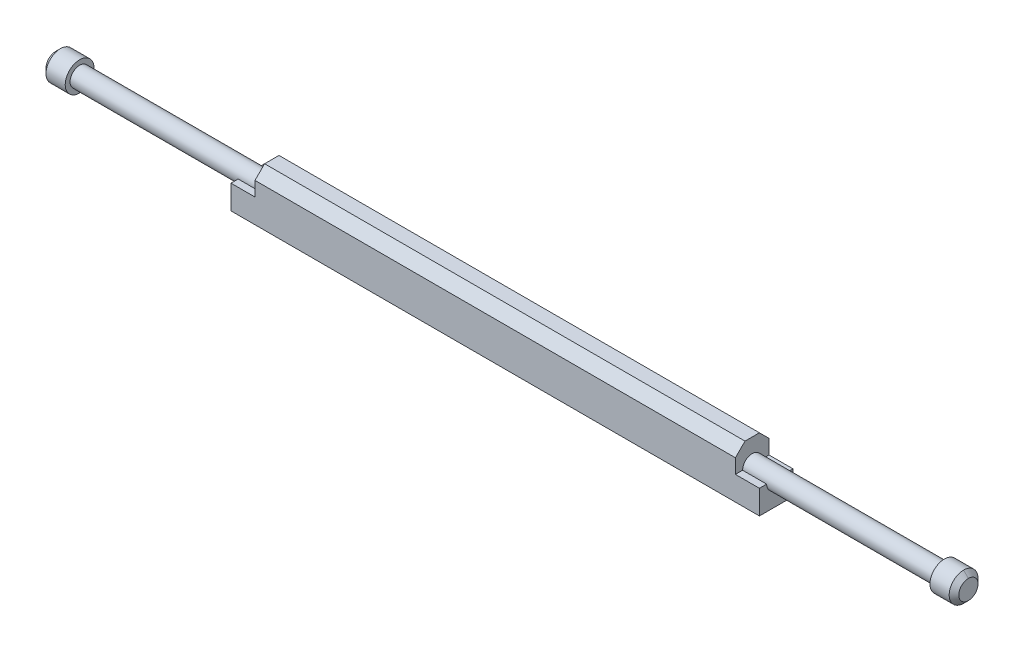
ISO-10303-21;
HEADER;
FILE_DESCRIPTION(('STEP AP214'),'2;1');
FILE_NAME('part.step','',(''),(''),'','','');
FILE_SCHEMA(('AUTOMOTIVE_DESIGN { 1 0 10303 214 1 1 1 1 }'));
ENDSEC;
DATA;
#1=APPLICATION_CONTEXT('core data for automotive mechanical design processes');
#2=APPLICATION_PROTOCOL_DEFINITION('international standard','automotive_design',2000,#1);
#3=PRODUCT_CONTEXT('',#1,'mechanical');
#4=PRODUCT('Part','Part','',(#3));
#5=PRODUCT_RELATED_PRODUCT_CATEGORY('part','',(#4));
#6=PRODUCT_DEFINITION_FORMATION('','',#4);
#7=PRODUCT_DEFINITION_CONTEXT('part definition',#1,'design');
#8=PRODUCT_DEFINITION('design','',#6,#7);
#9=PRODUCT_DEFINITION_SHAPE('','',#8);
#10=(LENGTH_UNIT() NAMED_UNIT(*) SI_UNIT(.MILLI.,.METRE.));
#11=(NAMED_UNIT(*) PLANE_ANGLE_UNIT() SI_UNIT($,.RADIAN.));
#12=(NAMED_UNIT(*) SI_UNIT($,.STERADIAN.) SOLID_ANGLE_UNIT());
#13=UNCERTAINTY_MEASURE_WITH_UNIT(LENGTH_MEASURE(1.E-05),#10,'distance_accuracy_value','');
#14=(GEOMETRIC_REPRESENTATION_CONTEXT(3) GLOBAL_UNCERTAINTY_ASSIGNED_CONTEXT((#13)) GLOBAL_UNIT_ASSIGNED_CONTEXT((#10,
#11,#12)) REPRESENTATION_CONTEXT('',''));
#15=CARTESIAN_POINT('',(0.,0.,0.));
#16=DIRECTION('',(0.,0.,1.));
#17=DIRECTION('',(1.,0.,0.));
#18=AXIS2_PLACEMENT_3D('',#15,#16,#17);
#19=CARTESIAN_POINT('',(95.0000003599995,6.8791694523184E-06,0.));
#20=DIRECTION('',(0.999999999999998,7.24123097499998E-08,0.));
#21=DIRECTION('',(-7.24123097499998E-08,0.999999999999997,0.));
#22=AXIS2_PLACEMENT_3D('',#19,#20,#21);
#23=PLANE('',#22);
#24=CARTESIAN_POINT('',(95.0000003625671,3.32969058710601E-06,3.5));
#25=DIRECTION('',(-0.999999999999998,-7.24123157157635E-08,0.));
#26=DIRECTION('',(7.24123157157635E-08,-0.999999999999997,0.));
#27=AXIS2_PLACEMENT_3D('',#24,#25,#26);
#28=CIRCLE('',#27,2.00000000256702);
#29=CARTESIAN_POINT('',(95.0000002177424,2.00000333212355,3.5));
#30=VERTEX_POINT('',#29);
#31=CARTESIAN_POINT('',(95.0000005073246,-1.99999667267535,3.5));
#32=VERTEX_POINT('',#31);
#33=EDGE_CURVE('E20',#30,#32,#28,.F.);
#34=ORIENTED_EDGE('',*,*,#33,.T.);
#35=CARTESIAN_POINT('',(95.000000362433,3.32969058728775E-06,3.5));
#36=DIRECTION('',(-0.999999999999998,-7.24123053298279E-08,0.));
#37=DIRECTION('',(7.24123053298279E-08,-0.999999999999997,0.));
#38=AXIS2_PLACEMENT_3D('',#35,#36,#37);
#39=CIRCLE('',#38,2.00000000243298);
#40=EDGE_CURVE('E144',#32,#30,#39,.F.);
#41=ORIENTED_EDGE('',*,*,#40,.T.);
#42=EDGE_LOOP('',(#34,#41));
#43=FACE_BOUND('',#42,.T.);
#44=ADVANCED_FACE('F17',(#43),#23,.T.);
#45=CARTESIAN_POINT('',(-95.0000003599995,6.8791694523184E-06,0.));
#46=DIRECTION('',(0.999999999999998,-7.24123097499998E-08,0.));
#47=DIRECTION('',(7.24123097499998E-08,0.999999999999997,0.));
#48=AXIS2_PLACEMENT_3D('',#45,#46,#47);
#49=PLANE('',#48);
#50=CARTESIAN_POINT('',(-95.000000362433,3.32969058923931E-06,3.5));
#51=DIRECTION('',(0.999999999999998,-7.24123053298278E-08,0.));
#52=DIRECTION('',(7.24123053298278E-08,0.999999999999997,0.));
#53=AXIS2_PLACEMENT_3D('',#50,#51,#52);
#54=CIRCLE('',#53,2.000000002433);
#55=CARTESIAN_POINT('',(-95.0000002176084,2.00000333225761,3.5));
#56=VERTEX_POINT('',#55);
#57=CARTESIAN_POINT('',(-95.0000005072576,-1.99999667287644,3.5));
#58=VERTEX_POINT('',#57);
#59=EDGE_CURVE('E154',#56,#58,#54,.F.);
#60=ORIENTED_EDGE('',*,*,#59,.T.);
#61=CARTESIAN_POINT('',(-95.000000362567,3.32969058905758E-06,3.5));
#62=DIRECTION('',(0.999999999999998,-7.24123157157635E-08,0.));
#63=DIRECTION('',(7.24123157157635E-08,0.999999999999997,0.));
#64=AXIS2_PLACEMENT_3D('',#61,#62,#63);
#65=CIRCLE('',#64,2.00000000256706);
#66=EDGE_CURVE('E201',#58,#56,#65,.F.);
#67=ORIENTED_EDGE('',*,*,#66,.T.);
#68=EDGE_LOOP('',(#60,#67));
#69=FACE_BOUND('',#68,.T.);
#70=ADVANCED_FACE('F640',(#69),#49,.F.);
#71=CARTESIAN_POINT('',(95.0000003648246,3.32969058726949E-06,3.5));
#72=DIRECTION('',(-0.999999999999998,-7.24123157157635E-08,0.));
#73=DIRECTION('',(7.24123157157635E-08,-0.999999999999997,0.));
#74=AXIS2_PLACEMENT_3D('',#71,#72,#73);
#75=CONICAL_SURFACE('',#74,2.00000000030942,0.785398159309759);
#76=CARTESIAN_POINT('',(94.00000036,3.2572782765E-06,3.5));
#77=DIRECTION('',(0.999999999999998,7.24123089999999E-08,0.));
#78=DIRECTION('',(-7.24123076383067E-08,0.999999999999997,0.));
#79=AXIS2_PLACEMENT_3D('',#76,#77,#78);
#80=CIRCLE('',#79,2.99999999972173);
#81=CARTESIAN_POINT('',(94.0000001431433,3.00000325772801,3.5));
#82=VERTEX_POINT('',#81);
#83=CARTESIAN_POINT('',(94.0000005776171,-2.99999674317146,3.5));
#84=VERTEX_POINT('',#83);
#85=EDGE_CURVE('E153',#82,#84,#80,.T.);
#86=ORIENTED_EDGE('',*,*,#85,.T.);
#87=DIRECTION('',(-0.707106730628404,-0.707106831744687,0.));
#88=VECTOR('',#87,1.);
#89=CARTESIAN_POINT('',(94.500000545,-2.4999967065,3.5));
#90=LINE('',#89,#88);
#91=EDGE_CURVE('E147',#84,#32,#90,.F.);
#92=ORIENTED_EDGE('',*,*,#91,.T.);
#93=ORIENTED_EDGE('',*,*,#33,.F.);
#94=DIRECTION('',(0.707106833034876,-0.707106729338216,0.));
#95=VECTOR('',#94,1.);
#96=CARTESIAN_POINT('',(94.5000001829384,2.50000329346887,3.5));
#97=LINE('',#96,#95);
#98=EDGE_CURVE('E149',#30,#82,#97,.F.);
#99=ORIENTED_EDGE('',*,*,#98,.T.);
#100=EDGE_LOOP('',(#86,#92,#93,#99));
#101=FACE_BOUND('',#100,.T.);
#102=ADVANCED_FACE('F152',(#101),#75,.T.);
#103=CARTESIAN_POINT('',(95.0000003651754,3.32969058748633E-06,3.5));
#104=DIRECTION('',(-0.999999999999998,-7.24123053298279E-08,0.));
#105=DIRECTION('',(7.24123053298279E-08,-0.999999999999997,0.));
#106=AXIS2_PLACEMENT_3D('',#103,#104,#105);
#107=CONICAL_SURFACE('',#106,1.99999999969059,0.785398162485149);
#108=CARTESIAN_POINT('',(94.00000036,3.2572782765E-06,3.5));
#109=DIRECTION('',(0.999999999999998,7.24123089999999E-08,0.));
#110=DIRECTION('',(7.2412307624873E-08,-0.999999999999997,0.));
#111=AXIS2_PLACEMENT_3D('',#108,#109,#110);
#112=CIRCLE('',#111,3.00000000027828);
#113=EDGE_CURVE('E221',#84,#82,#112,.T.);
#114=ORIENTED_EDGE('',*,*,#113,.T.);
#115=ORIENTED_EDGE('',*,*,#98,.F.);
#116=ORIENTED_EDGE('',*,*,#40,.F.);
#117=ORIENTED_EDGE('',*,*,#91,.F.);
#118=EDGE_LOOP('',(#114,#115,#116,#117));
#119=FACE_BOUND('',#118,.T.);
#120=ADVANCED_FACE('F146',(#119),#107,.T.);
#121=CARTESIAN_POINT('',(-95.0000003651754,3.3296905894379E-06,3.5));
#122=DIRECTION('',(0.999999999999998,-7.24123053298278E-08,0.));
#123=DIRECTION('',(7.24123053298278E-08,0.999999999999997,0.));
#124=AXIS2_PLACEMENT_3D('',#121,#122,#123);
#125=CONICAL_SURFACE('',#124,1.99999999969059,0.785398162485149);
#126=ORIENTED_EDGE('',*,*,#59,.F.);
#127=DIRECTION('',(0.707106835280216,0.707106727092874,0.));
#128=VECTOR('',#127,1.);
#129=CARTESIAN_POINT('',(-94.50000018,2.5000032935,3.5));
#130=LINE('',#129,#128);
#131=CARTESIAN_POINT('',(-94.0000001423829,3.00000325682854,3.5));
#132=VERTEX_POINT('',#131);
#133=EDGE_CURVE('E203',#56,#132,#130,.T.);
#134=ORIENTED_EDGE('',*,*,#133,.T.);
#135=CARTESIAN_POINT('',(-94.00000036,3.257278278E-06,3.5));
#136=DIRECTION('',(0.999999999999998,-7.24123100000001E-08,0.));
#137=DIRECTION('',(-7.24123076248729E-08,-0.999999999999997,0.));
#138=AXIS2_PLACEMENT_3D('',#135,#136,#137);
#139=CIRCLE('',#138,3.00000000027829);
#140=CARTESIAN_POINT('',(-94.0000005768568,-2.99999674227198,3.5));
#141=VERTEX_POINT('',#140);
#142=EDGE_CURVE('E223',#132,#141,#139,.F.);
#143=ORIENTED_EDGE('',*,*,#142,.T.);
#144=DIRECTION('',(-0.707106732873745,0.707106829499347,0.));
#145=VECTOR('',#144,1.);
#146=CARTESIAN_POINT('',(-94.5000005420615,-2.49999670653113,3.5));
#147=LINE('',#146,#145);
#148=EDGE_CURVE('E156',#141,#58,#147,.T.);
#149=ORIENTED_EDGE('',*,*,#148,.T.);
#150=EDGE_LOOP('',(#126,#134,#143,#149));
#151=FACE_BOUND('',#150,.T.);
#152=ADVANCED_FACE('F617',(#151),#125,.T.);
#153=CARTESIAN_POINT('',(-95.0000003648246,3.32969058922106E-06,3.5));
#154=DIRECTION('',(0.999999999999998,-7.24123157157635E-08,0.));
#155=DIRECTION('',(7.24123157157635E-08,0.999999999999997,0.));
#156=AXIS2_PLACEMENT_3D('',#153,#154,#155);
#157=CONICAL_SURFACE('',#156,2.00000000030942,0.785398159309759);
#158=ORIENTED_EDGE('',*,*,#66,.F.);
#159=ORIENTED_EDGE('',*,*,#148,.F.);
#160=CARTESIAN_POINT('',(-94.00000036,3.257278278E-06,3.5));
#161=DIRECTION('',(0.999999999999998,-7.24123100000001E-08,0.));
#162=DIRECTION('',(7.2412312264236E-08,0.999999999999997,0.));
#163=AXIS2_PLACEMENT_3D('',#160,#161,#162);
#164=CIRCLE('',#163,2.99999999972173);
#165=EDGE_CURVE('E200',#141,#132,#164,.F.);
#166=ORIENTED_EDGE('',*,*,#165,.T.);
#167=ORIENTED_EDGE('',*,*,#133,.F.);
#168=EDGE_LOOP('',(#158,#159,#166,#167));
#169=FACE_BOUND('',#168,.T.);
#170=ADVANCED_FACE('F608',(#169),#157,.T.);
#171=CARTESIAN_POINT('',(90.0000003627631,2.96762904094389E-06,3.5));
#172=DIRECTION('',(0.999999999999998,7.24123053275792E-08,0.));
#173=DIRECTION('',(-7.24123053275792E-08,0.999999999999997,0.));
#174=AXIS2_PLACEMENT_3D('',#171,#172,#173);
#175=CYLINDRICAL_SURFACE('',#174,2.99999999995366);
#176=CARTESIAN_POINT('',(90.00000036,2.9676290407438E-06,3.5));
#177=DIRECTION('',(0.999999999999998,7.24123053275792E-08,0.));
#178=DIRECTION('',(-7.24123053275792E-08,0.999999999999997,0.));
#179=AXIS2_PLACEMENT_3D('',#176,#177,#178);
#180=CIRCLE('',#179,2.99999999995366);
#181=CARTESIAN_POINT('',(90.0000001427631,3.00000296758269,3.5));
#182=VERTEX_POINT('',#181);
#183=EDGE_CURVE('E197',#182,#182,#180,.T.);
#184=ORIENTED_EDGE('',*,*,#183,.T.);
#185=EDGE_LOOP('',(#184));
#186=FACE_BOUND('',#185,.T.);
#187=ORIENTED_EDGE('',*,*,#85,.F.);
#188=ORIENTED_EDGE('',*,*,#113,.F.);
#189=EDGE_LOOP('',(#187,#188));
#190=FACE_BOUND('',#189,.T.);
#191=ADVANCED_FACE('F599',(#186,#190),#175,.T.);
#192=CARTESIAN_POINT('',(-94.0000003572369,3.25727827761406E-06,3.5));
#193=DIRECTION('',(0.999999999999998,-7.24123168901653E-08,0.));
#194=DIRECTION('',(7.24123168901653E-08,0.999999999999997,0.));
#195=AXIS2_PLACEMENT_3D('',#192,#193,#194);
#196=CYLINDRICAL_SURFACE('',#195,3.00000000004636);
#197=CARTESIAN_POINT('',(-90.00000036,2.96762901025348E-06,3.49999999999999));
#198=DIRECTION('',(0.999999999999998,-7.24123168901653E-08,0.));
#199=DIRECTION('',(7.24123168901653E-08,0.999999999999997,0.));
#200=AXIS2_PLACEMENT_3D('',#197,#198,#199);
#201=CIRCLE('',#200,3.00000000004636);
#202=CARTESIAN_POINT('',(-90.0000001427631,3.00000296767537,3.49999999999999));
#203=VERTEX_POINT('',#202);
#204=EDGE_CURVE('E194',#203,#203,#201,.F.);
#205=ORIENTED_EDGE('',*,*,#204,.T.);
#206=EDGE_LOOP('',(#205));
#207=FACE_BOUND('',#206,.T.);
#208=ORIENTED_EDGE('',*,*,#142,.F.);
#209=ORIENTED_EDGE('',*,*,#165,.F.);
#210=EDGE_LOOP('',(#208,#209));
#211=FACE_BOUND('',#210,.T.);
#212=ADVANCED_FACE('F590',(#207,#211),#196,.T.);
#213=CARTESIAN_POINT('',(90.0000003599995,6.5171079035684E-06,0.));
#214=DIRECTION('',(0.999999999999998,7.24123097499998E-08,0.));
#215=DIRECTION('',(-7.24123097499998E-08,0.999999999999997,0.));
#216=AXIS2_PLACEMENT_3D('',#213,#214,#215);
#217=PLANE('',#216);
#218=CARTESIAN_POINT('',(90.00000036,2.96762871704965E-06,3.5));
#219=DIRECTION('',(0.999999999999998,7.24123018541256E-08,0.));
#220=DIRECTION('',(-7.24123018541256E-08,0.999999999999997,0.));
#221=AXIS2_PLACEMENT_3D('',#218,#219,#220);
#222=CIRCLE('',#221,2.00000000011732);
#223=CARTESIAN_POINT('',(90.0000002151754,2.00000296774604,3.5));
#224=VERTEX_POINT('',#223);
#225=EDGE_CURVE('E191',#224,#224,#222,.T.);
#226=ORIENTED_EDGE('',*,*,#225,.T.);
#227=EDGE_LOOP('',(#226));
#228=FACE_BOUND('',#227,.T.);
#229=ORIENTED_EDGE('',*,*,#183,.F.);
#230=EDGE_LOOP('',(#229));
#231=FACE_BOUND('',#230,.T.);
#232=ADVANCED_FACE('F581',(#228,#231),#217,.F.);
#233=CARTESIAN_POINT('',(-90.0000003599995,6.5171079035684E-06,0.));
#234=DIRECTION('',(0.999999999999998,-7.24123097499998E-08,0.));
#235=DIRECTION('',(7.24123097499998E-08,0.999999999999997,0.));
#236=AXIS2_PLACEMENT_3D('',#233,#234,#235);
#237=PLANE('',#236);
#238=CARTESIAN_POINT('',(-90.00000036,2.96762904276293E-06,3.5));
#239=DIRECTION('',(0.999999999999998,-7.24123053051943E-08,0.));
#240=DIRECTION('',(7.24123053051943E-08,0.999999999999997,0.));
#241=AXIS2_PLACEMENT_3D('',#238,#239,#240);
#242=CIRCLE('',#241,2.00000000011707);
#243=CARTESIAN_POINT('',(-90.0000002151754,2.00000296774611,3.5));
#244=VERTEX_POINT('',#243);
#245=EDGE_CURVE('E187',#244,#244,#242,.F.);
#246=ORIENTED_EDGE('',*,*,#245,.T.);
#247=EDGE_LOOP('',(#246));
#248=FACE_BOUND('',#247,.T.);
#249=ORIENTED_EDGE('',*,*,#204,.F.);
#250=EDGE_LOOP('',(#249));
#251=FACE_BOUND('',#250,.T.);
#252=ADVANCED_FACE('F572',(#248,#251),#237,.T.);
#253=CARTESIAN_POINT('',(50.0000003648246,7.11366432339794E-08,3.5));
#254=DIRECTION('',(0.999999999999998,7.24123018541256E-08,0.));
#255=DIRECTION('',(-7.24123018541256E-08,0.999999999999997,0.));
#256=AXIS2_PLACEMENT_3D('',#253,#254,#255);
#257=CYLINDRICAL_SURFACE('',#256,2.00000000011732);
#258=ORIENTED_EDGE('',*,*,#225,.F.);
#259=EDGE_LOOP('',(#258));
#260=FACE_BOUND('',#259,.T.);
#261=DIRECTION('',(1.,0.,0.));
#262=VECTOR('',#261,1.);
#263=CARTESIAN_POINT('',(0.,0.,1.5));
#264=LINE('',#263,#262);
#265=CARTESIAN_POINT('',(55.00000036,0.,1.50000000005854));
#266=VERTEX_POINT('',#265);
#267=CARTESIAN_POINT('',(50.00000036,0.,1.50000000005852));
#268=VERTEX_POINT('',#267);
#269=EDGE_CURVE('E265',#266,#268,#264,.F.);
#270=ORIENTED_EDGE('',*,*,#269,.T.);
#271=CARTESIAN_POINT('',(50.00000036,7.11366428846178E-08,3.5));
#272=DIRECTION('',(0.999999999999998,7.24123018541256E-08,0.));
#273=DIRECTION('',(-7.24123018541256E-08,0.999999999999997,0.));
#274=AXIS2_PLACEMENT_3D('',#271,#272,#273);
#275=CIRCLE('',#274,2.00000000011732);
#276=CARTESIAN_POINT('',(50.00000036,0.,5.50000000005866));
#277=VERTEX_POINT('',#276);
#278=EDGE_CURVE('E174',#268,#277,#275,.T.);
#279=ORIENTED_EDGE('',*,*,#278,.T.);
#280=DIRECTION('',(1.,0.,0.));
#281=VECTOR('',#280,1.);
#282=CARTESIAN_POINT('',(0.,0.,5.5));
#283=LINE('',#282,#281);
#284=CARTESIAN_POINT('',(55.0000002875877,0.,5.50000000005864));
#285=VERTEX_POINT('',#284);
#286=EDGE_CURVE('E288',#277,#285,#283,.T.);
#287=ORIENTED_EDGE('',*,*,#286,.T.);
#288=CARTESIAN_POINT('',(55.00000036,4.33198221686152E-07,3.5));
#289=DIRECTION('',(0.999999999999998,7.24123157220188E-08,0.));
#290=DIRECTION('',(-7.24123157220188E-08,0.999999999999997,0.));
#291=AXIS2_PLACEMENT_3D('',#288,#289,#290);
#292=CIRCLE('',#291,1.99999999988296);
#293=EDGE_CURVE('E179',#285,#266,#292,.T.);
#294=ORIENTED_EDGE('',*,*,#293,.T.);
#295=EDGE_LOOP('',(#270,#279,#287,#294));
#296=FACE_BOUND('',#295,.T.);
#297=ADVANCED_FACE('F400',(#260,#296),#257,.T.);
#298=CARTESIAN_POINT('',(0.,5.,0.));
#299=DIRECTION('',(0.,1.,0.));
#300=DIRECTION('',(0.,0.,1.));
#301=AXIS2_PLACEMENT_3D('',#298,#299,#300);
#302=PLANE('',#301);
#303=DIRECTION('',(1.,0.,0.));
#304=VECTOR('',#303,1.);
#305=CARTESIAN_POINT('',(0.,5.,5.));
#306=LINE('',#305,#304);
#307=CARTESIAN_POINT('',(-50.0000000344846,5.,5.));
#308=VERTEX_POINT('',#307);
#309=CARTESIAN_POINT('',(49.9999999994846,5.00000001775,5.));
#310=VERTEX_POINT('',#309);
#311=EDGE_CURVE('E190',#308,#310,#306,.T.);
#312=ORIENTED_EDGE('',*,*,#311,.T.);
#313=DIRECTION('',(0.,0.,1.));
#314=VECTOR('',#313,1.);
#315=CARTESIAN_POINT('',(49.9999999979385,5.000000071,0.));
#316=LINE('',#315,#314);
#317=CARTESIAN_POINT('',(50.0000000339692,5.00000004444571,2.00000000880429));
#318=VERTEX_POINT('',#317);
#319=EDGE_CURVE('E336',#310,#318,#316,.F.);
#320=ORIENTED_EDGE('',*,*,#319,.T.);
#321=DIRECTION('',(1.,0.,0.));
#322=VECTOR('',#321,1.);
#323=CARTESIAN_POINT('',(0.,5.00000003578284,2.00000003521716));
#324=LINE('',#323,#322);
#325=CARTESIAN_POINT('',(-49.9999999989692,5.00000000894571,2.00000000880429));
#326=VERTEX_POINT('',#325);
#327=EDGE_CURVE('E173',#318,#326,#324,.F.);
#328=ORIENTED_EDGE('',*,*,#327,.T.);
#329=DIRECTION('',(0.,0.,1.));
#330=VECTOR('',#329,1.);
#331=CARTESIAN_POINT('',(-49.9999999979385,5.,0.));
#332=LINE('',#331,#330);
#333=EDGE_CURVE('E302',#326,#308,#332,.T.);
#334=ORIENTED_EDGE('',*,*,#333,.T.);
#335=EDGE_LOOP('',(#312,#320,#328,#334));
#336=FACE_BOUND('',#335,.T.);
#337=ADVANCED_FACE('F413',(#336),#302,.T.);
#338=CARTESIAN_POINT('',(-90.0000003648246,2.96762904311229E-06,3.5));
#339=DIRECTION('',(0.999999999999998,-7.24123053051943E-08,0.));
#340=DIRECTION('',(7.24123053051943E-08,0.999999999999997,0.));
#341=AXIS2_PLACEMENT_3D('',#338,#339,#340);
#342=CYLINDRICAL_SURFACE('',#341,2.00000000011707);
#343=ORIENTED_EDGE('',*,*,#245,.F.);
#344=EDGE_LOOP('',(#343));
#345=FACE_BOUND('',#344,.T.);
#346=DIRECTION('',(1.,0.,0.));
#347=VECTOR('',#346,1.);
#348=CARTESIAN_POINT('',(0.,0.,5.5));
#349=LINE('',#348,#347);
#350=CARTESIAN_POINT('',(-55.00000036,0.,5.50000000005845));
#351=VERTEX_POINT('',#350);
#352=CARTESIAN_POINT('',(-50.00000036,-4.14601686386267E-12,5.50000000005846));
#353=VERTEX_POINT('',#352);
#354=EDGE_CURVE('E291',#351,#353,#349,.T.);
#355=ORIENTED_EDGE('',*,*,#354,.T.);
#356=CARTESIAN_POINT('',(-50.00000036,7.11364133384825E-08,3.5));
#357=DIRECTION('',(0.999999999999998,-7.2412315740397E-08,0.));
#358=DIRECTION('',(7.2412315740397E-08,0.999999999999997,0.));
#359=AXIS2_PLACEMENT_3D('',#356,#357,#358);
#360=CIRCLE('',#359,1.99999999988273);
#361=CARTESIAN_POINT('',(-50.00000036,0.,1.50000000005863));
#362=VERTEX_POINT('',#361);
#363=EDGE_CURVE('E183',#353,#362,#360,.F.);
#364=ORIENTED_EDGE('',*,*,#363,.T.);
#365=DIRECTION('',(1.,0.,0.));
#366=VECTOR('',#365,1.);
#367=CARTESIAN_POINT('',(0.,0.,1.5));
#368=LINE('',#367,#366);
#369=CARTESIAN_POINT('',(-55.0000002875877,0.,1.50000000005866));
#370=VERTEX_POINT('',#369);
#371=EDGE_CURVE('E246',#362,#370,#368,.F.);
#372=ORIENTED_EDGE('',*,*,#371,.T.);
#373=CARTESIAN_POINT('',(-55.00000036,4.33198357081119E-07,3.49999999999988));
#374=DIRECTION('',(0.999999999999998,-7.24123053051943E-08,0.));
#375=DIRECTION('',(7.24123053051943E-08,0.999999999999997,0.));
#376=AXIS2_PLACEMENT_3D('',#373,#374,#375);
#377=CIRCLE('',#376,2.00000000011707);
#378=EDGE_CURVE('E169',#370,#351,#377,.F.);
#379=ORIENTED_EDGE('',*,*,#378,.T.);
#380=EDGE_LOOP('',(#355,#364,#372,#379));
#381=FACE_BOUND('',#380,.T.);
#382=ADVANCED_FACE('F411',(#345,#381),#342,.T.);
#383=CARTESIAN_POINT('',(0.,5.,5.));
#384=DIRECTION('',(0.,0.707106781186548,0.707106781186548));
#385=DIRECTION('',(0.,-0.707106781186548,0.707106781186548));
#386=AXIS2_PLACEMENT_3D('',#383,#384,#385);
#387=PLANE('',#386);
#388=DIRECTION('',(1.,0.,0.));
#389=VECTOR('',#388,1.);
#390=CARTESIAN_POINT('',(0.,3.,7.));
#391=LINE('',#390,#389);
#392=CARTESIAN_POINT('',(-50.0000001956908,3.,7.));
#393=VERTEX_POINT('',#392);
#394=CARTESIAN_POINT('',(50.0000000706908,3.,7.));
#395=VERTEX_POINT('',#394);
#396=EDGE_CURVE('E283',#393,#395,#391,.T.);
#397=ORIENTED_EDGE('',*,*,#396,.T.);
#398=DIRECTION('',(-5.12032361298321E-08,0.707106793737691,-0.707106768635402));
#399=VECTOR('',#398,1.);
#400=CARTESIAN_POINT('',(50.0000001427631,3.,7.));
#401=LINE('',#400,#399);
#402=EDGE_CURVE('E333',#395,#310,#401,.T.);
#403=ORIENTED_EDGE('',*,*,#402,.T.);
#404=ORIENTED_EDGE('',*,*,#311,.F.);
#405=DIRECTION('',(-5.12032345854201E-08,-0.707106781186546,0.707106781186547));
#406=VECTOR('',#405,1.);
#407=CARTESIAN_POINT('',(-49.9999999979385,5.,5.));
#408=LINE('',#407,#406);
#409=EDGE_CURVE('E315',#308,#393,#408,.T.);
#410=ORIENTED_EDGE('',*,*,#409,.T.);
#411=EDGE_LOOP('',(#397,#403,#404,#410));
#412=FACE_BOUND('',#411,.T.);
#413=ADVANCED_FACE('F405',(#412),#387,.T.);
#414=CARTESIAN_POINT('',(0.,0.,0.));
#415=DIRECTION('',(0.,-1.,0.));
#416=DIRECTION('',(0.,0.,-1.));
#417=AXIS2_PLACEMENT_3D('',#414,#415,#416);
#418=PLANE('',#417);
#419=DIRECTION('',(0.,0.,1.));
#420=VECTOR('',#419,1.);
#421=CARTESIAN_POINT('',(50.00000036,0.,0.));
#422=LINE('',#421,#420);
#423=CARTESIAN_POINT('',(50.00000036,0.,7.00000000000001));
#424=VERTEX_POINT('',#423);
#425=EDGE_CURVE('E177',#277,#424,#422,.T.);
#426=ORIENTED_EDGE('',*,*,#425,.T.);
#427=DIRECTION('',(1.,0.,0.));
#428=VECTOR('',#427,1.);
#429=CARTESIAN_POINT('',(0.,0.,7.));
#430=LINE('',#429,#428);
#431=CARTESIAN_POINT('',(55.00000036,0.,7.));
#432=VERTEX_POINT('',#431);
#433=EDGE_CURVE('E253',#424,#432,#430,.T.);
#434=ORIENTED_EDGE('',*,*,#433,.T.);
#435=DIRECTION('',(0.,0.,1.));
#436=VECTOR('',#435,1.);
#437=CARTESIAN_POINT('',(55.00000036,0.,0.));
#438=LINE('',#437,#436);
#439=EDGE_CURVE('E182',#432,#285,#438,.F.);
#440=ORIENTED_EDGE('',*,*,#439,.T.);
#441=ORIENTED_EDGE('',*,*,#286,.F.);
#442=EDGE_LOOP('',(#426,#434,#440,#441));
#443=FACE_BOUND('',#442,.T.);
#444=ADVANCED_FACE('F402',(#443),#418,.F.);
#445=CARTESIAN_POINT('',(0.,0.,0.));
#446=DIRECTION('',(0.,-1.,0.));
#447=DIRECTION('',(0.,0.,-1.));
#448=AXIS2_PLACEMENT_3D('',#445,#446,#447);
#449=PLANE('',#448);
#450=DIRECTION('',(0.,0.,1.));
#451=VECTOR('',#450,1.);
#452=CARTESIAN_POINT('',(-55.00000036,0.,0.));
#453=LINE('',#452,#451);
#454=CARTESIAN_POINT('',(-55.00000036,0.,7.));
#455=VERTEX_POINT('',#454);
#456=EDGE_CURVE('E172',#351,#455,#453,.T.);
#457=ORIENTED_EDGE('',*,*,#456,.T.);
#458=DIRECTION('',(1.,0.,0.));
#459=VECTOR('',#458,1.);
#460=CARTESIAN_POINT('',(0.,0.,7.));
#461=LINE('',#460,#459);
#462=CARTESIAN_POINT('',(-50.00000036,-4.14601686259605E-12,7.));
#463=VERTEX_POINT('',#462);
#464=EDGE_CURVE('E235',#455,#463,#461,.T.);
#465=ORIENTED_EDGE('',*,*,#464,.T.);
#466=DIRECTION('',(0.,0.,1.));
#467=VECTOR('',#466,1.);
#468=CARTESIAN_POINT('',(-50.00000036,-8.29203372601928E-12,0.));
#469=LINE('',#468,#467);
#470=EDGE_CURVE('E186',#463,#353,#469,.F.);
#471=ORIENTED_EDGE('',*,*,#470,.T.);
#472=ORIENTED_EDGE('',*,*,#354,.F.);
#473=EDGE_LOOP('',(#457,#465,#471,#472));
#474=FACE_BOUND('',#473,.T.);
#475=ADVANCED_FACE('F409',(#474),#449,.F.);
#476=CARTESIAN_POINT('',(-50.0000003599997,3.62061558456841E-06,0.));
#477=DIRECTION('',(0.999999999999998,-7.24123111699998E-08,0.));
#478=DIRECTION('',(7.24123111699998E-08,0.999999999999997,0.));
#479=AXIS2_PLACEMENT_3D('',#476,#477,#478);
#480=PLANE('',#479);
#481=DIRECTION('',(0.,1.,0.));
#482=VECTOR('',#481,1.);
#483=CARTESIAN_POINT('',(-50.00000014,0.,0.));
#484=LINE('',#483,#482);
#485=CARTESIAN_POINT('',(-50.0000001063815,3.00000000007071,-7.07106628024951E-11));
#486=VERTEX_POINT('',#485);
#487=CARTESIAN_POINT('',(-50.0000003325,-4.146016863E-12,0.));
#488=VERTEX_POINT('',#487);
#489=EDGE_CURVE('E238',#486,#488,#484,.F.);
#490=ORIENTED_EDGE('',*,*,#489,.T.);
#491=DIRECTION('',(0.,0.,-1.));
#492=VECTOR('',#491,1.);
#493=CARTESIAN_POINT('',(-50.00000036,0.,0.));
#494=LINE('',#493,#492);
#495=EDGE_CURVE('E185',#488,#362,#494,.F.);
#496=ORIENTED_EDGE('',*,*,#495,.T.);
#497=ORIENTED_EDGE('',*,*,#363,.F.);
#498=ORIENTED_EDGE('',*,*,#470,.F.);
#499=DIRECTION('',(0.,1.,0.));
#500=VECTOR('',#499,1.);
#501=CARTESIAN_POINT('',(-50.00000036,0.,7.));
#502=LINE('',#501,#500);
#503=EDGE_CURVE('E231',#463,#393,#502,.T.);
#504=ORIENTED_EDGE('',*,*,#503,.T.);
#505=ORIENTED_EDGE('',*,*,#409,.F.);
#506=ORIENTED_EDGE('',*,*,#333,.F.);
#507=DIRECTION('',(0.,-0.707106781186548,-0.707106781186548));
#508=VECTOR('',#507,1.);
#509=CARTESIAN_POINT('',(-50.,1.50000000028284,-1.50000000028284));
#510=LINE('',#509,#508);
#511=EDGE_CURVE('E338',#326,#486,#510,.T.);
#512=ORIENTED_EDGE('',*,*,#511,.T.);
#513=EDGE_LOOP('',(#490,#496,#497,#498,#504,#505,#506,#512));
#514=FACE_BOUND('',#513,.T.);
#515=ADVANCED_FACE('F387',(#514),#480,.F.);
#516=CARTESIAN_POINT('',(0.,0.,0.));
#517=DIRECTION('',(0.,-1.,0.));
#518=DIRECTION('',(0.,0.,-1.));
#519=AXIS2_PLACEMENT_3D('',#516,#517,#518);
#520=PLANE('',#519);
#521=ORIENTED_EDGE('',*,*,#495,.F.);
#522=DIRECTION('',(1.,0.,0.));
#523=VECTOR('',#522,1.);
#524=CARTESIAN_POINT('',(0.,-8.292033726E-12,0.));
#525=LINE('',#524,#523);
#526=CARTESIAN_POINT('',(-55.00000036,0.,0.));
#527=VERTEX_POINT('',#526);
#528=EDGE_CURVE('E241',#488,#527,#525,.F.);
#529=ORIENTED_EDGE('',*,*,#528,.T.);
#530=DIRECTION('',(0.,0.,1.));
#531=VECTOR('',#530,1.);
#532=CARTESIAN_POINT('',(-55.00000036,0.,0.));
#533=LINE('',#532,#531);
#534=EDGE_CURVE('E349',#527,#370,#533,.T.);
#535=ORIENTED_EDGE('',*,*,#534,.T.);
#536=ORIENTED_EDGE('',*,*,#371,.F.);
#537=EDGE_LOOP('',(#521,#529,#535,#536));
#538=FACE_BOUND('',#537,.T.);
#539=ADVANCED_FACE('F384',(#538),#520,.F.);
#540=CARTESIAN_POINT('',(55.00000036,0.,0.));
#541=DIRECTION('',(-1.,0.,0.));
#542=DIRECTION('',(0.,0.,1.));
#543=AXIS2_PLACEMENT_3D('',#540,#541,#542);
#544=PLANE('',#543);
#545=ORIENTED_EDGE('',*,*,#293,.F.);
#546=ORIENTED_EDGE('',*,*,#439,.F.);
#547=DIRECTION('',(0.,1.,0.));
#548=VECTOR('',#547,1.);
#549=CARTESIAN_POINT('',(55.00000036,0.,7.));
#550=LINE('',#549,#548);
#551=CARTESIAN_POINT('',(55.00000036,-5.,7.));
#552=VERTEX_POINT('',#551);
#553=EDGE_CURVE('E249',#432,#552,#550,.F.);
#554=ORIENTED_EDGE('',*,*,#553,.T.);
#555=DIRECTION('',(0.,0.,-1.));
#556=VECTOR('',#555,1.);
#557=CARTESIAN_POINT('',(55.00000036,-5.,0.));
#558=LINE('',#557,#556);
#559=CARTESIAN_POINT('',(55.00000036,-5.,0.));
#560=VERTEX_POINT('',#559);
#561=EDGE_CURVE('E234',#552,#560,#558,.T.);
#562=ORIENTED_EDGE('',*,*,#561,.T.);
#563=DIRECTION('',(0.,1.,0.));
#564=VECTOR('',#563,1.);
#565=CARTESIAN_POINT('',(55.00000036,0.,0.));
#566=LINE('',#565,#564);
#567=CARTESIAN_POINT('',(55.00000036,0.,0.));
#568=VERTEX_POINT('',#567);
#569=EDGE_CURVE('E256',#560,#568,#566,.T.);
#570=ORIENTED_EDGE('',*,*,#569,.T.);
#571=DIRECTION('',(0.,0.,-1.));
#572=VECTOR('',#571,1.);
#573=CARTESIAN_POINT('',(55.00000036,0.,0.));
#574=LINE('',#573,#572);
#575=EDGE_CURVE('E181',#568,#266,#574,.F.);
#576=ORIENTED_EDGE('',*,*,#575,.T.);
#577=EDGE_LOOP('',(#545,#546,#554,#562,#570,#576));
#578=FACE_BOUND('',#577,.T.);
#579=ADVANCED_FACE('F375',(#578),#544,.F.);
#580=CARTESIAN_POINT('',(0.,0.,0.));
#581=DIRECTION('',(0.,-1.,0.));
#582=DIRECTION('',(0.,0.,-1.));
#583=AXIS2_PLACEMENT_3D('',#580,#581,#582);
#584=PLANE('',#583);
#585=ORIENTED_EDGE('',*,*,#575,.F.);
#586=DIRECTION('',(1.,0.,0.));
#587=VECTOR('',#586,1.);
#588=CARTESIAN_POINT('',(0.,0.,0.));
#589=LINE('',#588,#587);
#590=CARTESIAN_POINT('',(50.00000036,0.,0.));
#591=VERTEX_POINT('',#590);
#592=EDGE_CURVE('E259',#568,#591,#589,.F.);
#593=ORIENTED_EDGE('',*,*,#592,.T.);
#594=DIRECTION('',(0.,0.,1.));
#595=VECTOR('',#594,1.);
#596=CARTESIAN_POINT('',(50.00000036,0.,0.));
#597=LINE('',#596,#595);
#598=EDGE_CURVE('E178',#591,#268,#597,.T.);
#599=ORIENTED_EDGE('',*,*,#598,.T.);
#600=ORIENTED_EDGE('',*,*,#269,.F.);
#601=EDGE_LOOP('',(#585,#593,#599,#600));
#602=FACE_BOUND('',#601,.T.);
#603=ADVANCED_FACE('F398',(#602),#584,.F.);
#604=CARTESIAN_POINT('',(50.0000003599997,3.62061551356841E-06,0.));
#605=DIRECTION('',(0.999999999999998,7.24123097499998E-08,0.));
#606=DIRECTION('',(-7.24123097499998E-08,0.999999999999997,0.));
#607=AXIS2_PLACEMENT_3D('',#604,#605,#606);
#608=PLANE('',#607);
#609=ORIENTED_EDGE('',*,*,#402,.F.);
#610=DIRECTION('',(0.,1.,0.));
#611=VECTOR('',#610,1.);
#612=CARTESIAN_POINT('',(50.00000014,0.,7.));
#613=LINE('',#612,#611);
#614=EDGE_CURVE('E280',#395,#424,#613,.F.);
#615=ORIENTED_EDGE('',*,*,#614,.T.);
#616=ORIENTED_EDGE('',*,*,#425,.F.);
#617=ORIENTED_EDGE('',*,*,#278,.F.);
#618=ORIENTED_EDGE('',*,*,#598,.F.);
#619=DIRECTION('',(0.,1.,0.));
#620=VECTOR('',#619,1.);
#621=CARTESIAN_POINT('',(50.00000047,0.,0.));
#622=LINE('',#621,#620);
#623=CARTESIAN_POINT('',(50.0000002238815,3.00000000007071,-7.07100393862459E-11));
#624=VERTEX_POINT('',#623);
#625=EDGE_CURVE('E270',#591,#624,#622,.T.);
#626=ORIENTED_EDGE('',*,*,#625,.T.);
#627=DIRECTION('',(0.,-0.707106781186548,-0.707106781186548));
#628=VECTOR('',#627,1.);
#629=CARTESIAN_POINT('',(50.00000014,1.50000000028284,-1.50000000028284));
#630=LINE('',#629,#628);
#631=EDGE_CURVE('E341',#624,#318,#630,.F.);
#632=ORIENTED_EDGE('',*,*,#631,.T.);
#633=ORIENTED_EDGE('',*,*,#319,.F.);
#634=EDGE_LOOP('',(#609,#615,#616,#617,#618,#626,#632,#633));
#635=FACE_BOUND('',#634,.T.);
#636=ADVANCED_FACE('F393',(#635),#608,.T.);
#637=CARTESIAN_POINT('',(0.,1.50000000028284,-1.50000000028284));
#638=DIRECTION('',(0.,-0.707106781186548,0.707106781186548));
#639=DIRECTION('',(0.,-0.707106781186548,-0.707106781186548));
#640=AXIS2_PLACEMENT_3D('',#637,#638,#639);
#641=PLANE('',#640);
#642=ORIENTED_EDGE('',*,*,#631,.F.);
#643=DIRECTION('',(1.,0.,0.));
#644=VECTOR('',#643,1.);
#645=CARTESIAN_POINT('',(0.,3.,0.));
#646=LINE('',#645,#644);
#647=EDGE_CURVE('E275',#624,#486,#646,.F.);
#648=ORIENTED_EDGE('',*,*,#647,.T.);
#649=ORIENTED_EDGE('',*,*,#511,.F.);
#650=ORIENTED_EDGE('',*,*,#327,.F.);
#651=EDGE_LOOP('',(#642,#648,#649,#650));
#652=FACE_BOUND('',#651,.T.);
#653=ADVANCED_FACE('F446',(#652),#641,.F.);
#654=CARTESIAN_POINT('',(-55.00000036,0.,0.));
#655=DIRECTION('',(-1.,0.,0.));
#656=DIRECTION('',(0.,0.,1.));
#657=AXIS2_PLACEMENT_3D('',#654,#655,#656);
#658=PLANE('',#657);
#659=DIRECTION('',(0.,1.,0.));
#660=VECTOR('',#659,1.);
#661=CARTESIAN_POINT('',(-55.00000047,0.,0.));
#662=LINE('',#661,#660);
#663=CARTESIAN_POINT('',(-55.000000415,-5.,0.));
#664=VERTEX_POINT('',#663);
#665=EDGE_CURVE('E260',#527,#664,#662,.F.);
#666=ORIENTED_EDGE('',*,*,#665,.T.);
#667=DIRECTION('',(0.,0.,-1.));
#668=VECTOR('',#667,1.);
#669=CARTESIAN_POINT('',(-55.00000036,-5.,0.));
#670=LINE('',#669,#668);
#671=CARTESIAN_POINT('',(-55.00000036,-5.,7.));
#672=VERTEX_POINT('',#671);
#673=EDGE_CURVE('E360',#664,#672,#670,.F.);
#674=ORIENTED_EDGE('',*,*,#673,.T.);
#675=DIRECTION('',(0.,1.,0.));
#676=VECTOR('',#675,1.);
#677=CARTESIAN_POINT('',(-55.00000036,0.,7.));
#678=LINE('',#677,#676);
#679=EDGE_CURVE('E252',#672,#455,#678,.T.);
#680=ORIENTED_EDGE('',*,*,#679,.T.);
#681=ORIENTED_EDGE('',*,*,#456,.F.);
#682=ORIENTED_EDGE('',*,*,#378,.F.);
#683=ORIENTED_EDGE('',*,*,#534,.F.);
#684=EDGE_LOOP('',(#666,#674,#680,#681,#682,#683));
#685=FACE_BOUND('',#684,.T.);
#686=ADVANCED_FACE('F378',(#685),#658,.T.);
#687=CARTESIAN_POINT('',(0.,0.,7.));
#688=DIRECTION('',(0.,0.,1.));
#689=DIRECTION('',(1.,0.,0.));
#690=AXIS2_PLACEMENT_3D('',#687,#688,#689);
#691=PLANE('',#690);
#692=ORIENTED_EDGE('',*,*,#464,.F.);
#693=ORIENTED_EDGE('',*,*,#679,.F.);
#694=DIRECTION('',(1.,0.,0.));
#695=VECTOR('',#694,1.);
#696=CARTESIAN_POINT('',(0.,-5.,7.));
#697=LINE('',#696,#695);
#698=EDGE_CURVE('E363',#672,#552,#697,.T.);
#699=ORIENTED_EDGE('',*,*,#698,.T.);
#700=ORIENTED_EDGE('',*,*,#553,.F.);
#701=ORIENTED_EDGE('',*,*,#433,.F.);
#702=ORIENTED_EDGE('',*,*,#614,.F.);
#703=ORIENTED_EDGE('',*,*,#396,.F.);
#704=ORIENTED_EDGE('',*,*,#503,.F.);
#705=EDGE_LOOP('',(#692,#693,#699,#700,#701,#702,#703,#704));
#706=FACE_BOUND('',#705,.T.);
#707=ADVANCED_FACE('F369',(#706),#691,.T.);
#708=CARTESIAN_POINT('',(0.,0.,0.));
#709=DIRECTION('',(0.,0.,1.));
#710=DIRECTION('',(1.,0.,0.));
#711=AXIS2_PLACEMENT_3D('',#708,#709,#710);
#712=PLANE('',#711);
#713=ORIENTED_EDGE('',*,*,#625,.F.);
#714=ORIENTED_EDGE('',*,*,#592,.F.);
#715=ORIENTED_EDGE('',*,*,#569,.F.);
#716=DIRECTION('',(1.,0.,0.));
#717=VECTOR('',#716,1.);
#718=CARTESIAN_POINT('',(0.,-5.,0.));
#719=LINE('',#718,#717);
#720=EDGE_CURVE('E35',#560,#664,#719,.F.);
#721=ORIENTED_EDGE('',*,*,#720,.T.);
#722=ORIENTED_EDGE('',*,*,#665,.F.);
#723=ORIENTED_EDGE('',*,*,#528,.F.);
#724=ORIENTED_EDGE('',*,*,#489,.F.);
#725=ORIENTED_EDGE('',*,*,#647,.F.);
#726=EDGE_LOOP('',(#713,#714,#715,#721,#722,#723,#724,#725));
#727=FACE_BOUND('',#726,.T.);
#728=ADVANCED_FACE('F382',(#727),#712,.F.);
#729=CARTESIAN_POINT('',(0.,-5.,0.));
#730=DIRECTION('',(0.,-1.,0.));
#731=DIRECTION('',(0.,0.,-1.));
#732=AXIS2_PLACEMENT_3D('',#729,#730,#731);
#733=PLANE('',#732);
#734=CARTESIAN_POINT('',(0.,-5.,3.5));
#735=DIRECTION('',(0.,1.,0.));
#736=DIRECTION('',(0.,0.,1.));
#737=AXIS2_PLACEMENT_3D('',#734,#735,#736);
#738=CIRCLE('',#737,3.00000000037846);
#739=CARTESIAN_POINT('',(0.,-5.,6.50000000037846));
#740=VERTEX_POINT('',#739);
#741=EDGE_CURVE('E26',#740,#740,#738,.T.);
#742=ORIENTED_EDGE('',*,*,#741,.T.);
#743=EDGE_LOOP('',(#742));
#744=FACE_BOUND('',#743,.T.);
#745=ORIENTED_EDGE('',*,*,#720,.F.);
#746=ORIENTED_EDGE('',*,*,#561,.F.);
#747=ORIENTED_EDGE('',*,*,#698,.F.);
#748=ORIENTED_EDGE('',*,*,#673,.F.);
#749=EDGE_LOOP('',(#745,#746,#747,#748));
#750=FACE_BOUND('',#749,.T.);
#751=ADVANCED_FACE('F376',(#744,#750),#733,.T.);
#752=CARTESIAN_POINT('',(0.,-5.,3.5));
#753=DIRECTION('',(0.,1.,0.));
#754=DIRECTION('',(0.,0.,1.));
#755=AXIS2_PLACEMENT_3D('',#752,#753,#754);
#756=CYLINDRICAL_SURFACE('',#755,3.00000000037846);
#757=CARTESIAN_POINT('',(0.,3.,3.5));
#758=DIRECTION('',(0.,1.,0.));
#759=DIRECTION('',(0.,0.,1.));
#760=AXIS2_PLACEMENT_3D('',#757,#758,#759);
#761=CIRCLE('',#760,3.00000000037846);
#762=CARTESIAN_POINT('',(0.,3.,6.50000000037846));
#763=VERTEX_POINT('',#762);
#764=EDGE_CURVE('E11',#763,#763,#761,.T.);
#765=ORIENTED_EDGE('',*,*,#764,.T.);
#766=EDGE_LOOP('',(#765));
#767=FACE_BOUND('',#766,.T.);
#768=ORIENTED_EDGE('',*,*,#741,.F.);
#769=EDGE_LOOP('',(#768));
#770=FACE_BOUND('',#769,.T.);
#771=ADVANCED_FACE('F427',(#767,#770),#756,.F.);
#772=CARTESIAN_POINT('',(0.,3.,0.));
#773=DIRECTION('',(0.,1.,0.));
#774=DIRECTION('',(0.,0.,1.));
#775=AXIS2_PLACEMENT_3D('',#772,#773,#774);
#776=PLANE('',#775);
#777=ORIENTED_EDGE('',*,*,#764,.F.);
#778=EDGE_LOOP('',(#777));
#779=FACE_BOUND('',#778,.T.);
#780=ADVANCED_FACE('F425',(#779),#776,.F.);
#781=CLOSED_SHELL('',(#44,#70,#102,#120,#152,#170,#191,#212,#232,#252,#297,#337,#382,#413,#444,
#475,#515,#539,#579,#603,#636,#653,#686,#707,#728,#751,#771,#780));
#782=MANIFOLD_SOLID_BREP('B1',#781);
#783=ADVANCED_BREP_SHAPE_REPRESENTATION('',(#18,#782),#14);
#784=SHAPE_DEFINITION_REPRESENTATION(#9,#783);
ENDSEC;
END-ISO-10303-21;
